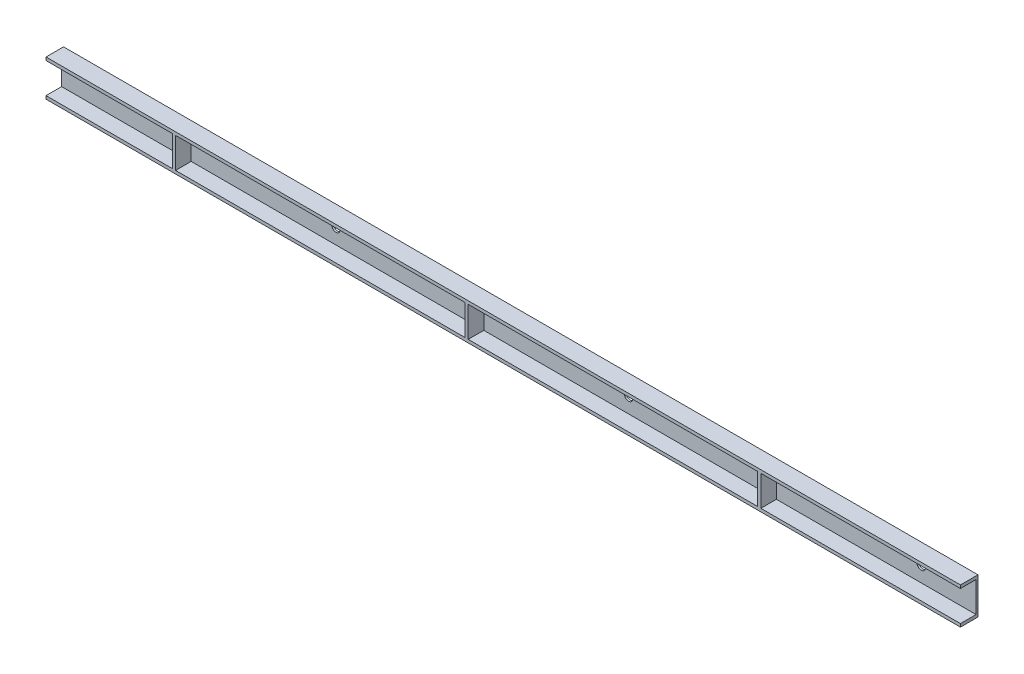
ISO-10303-21;
HEADER;
FILE_DESCRIPTION(('STEP AP214'),'2;1');
FILE_NAME('part.step','',(''),(''),'','','');
FILE_SCHEMA(('AUTOMOTIVE_DESIGN { 1 0 10303 214 1 1 1 1 }'));
ENDSEC;
DATA;
#1=APPLICATION_CONTEXT('core data for automotive mechanical design processes');
#2=APPLICATION_PROTOCOL_DEFINITION('international standard','automotive_design',2000,#1);
#3=PRODUCT_CONTEXT('',#1,'mechanical');
#4=PRODUCT('Part','Part','',(#3));
#5=PRODUCT_RELATED_PRODUCT_CATEGORY('part','',(#4));
#6=PRODUCT_DEFINITION_FORMATION('','',#4);
#7=PRODUCT_DEFINITION_CONTEXT('part definition',#1,'design');
#8=PRODUCT_DEFINITION('design','',#6,#7);
#9=PRODUCT_DEFINITION_SHAPE('','',#8);
#10=(LENGTH_UNIT() NAMED_UNIT(*) SI_UNIT(.MILLI.,.METRE.));
#11=(NAMED_UNIT(*) PLANE_ANGLE_UNIT() SI_UNIT($,.RADIAN.));
#12=(NAMED_UNIT(*) SI_UNIT($,.STERADIAN.) SOLID_ANGLE_UNIT());
#13=UNCERTAINTY_MEASURE_WITH_UNIT(LENGTH_MEASURE(1.E-05),#10,'distance_accuracy_value','');
#14=(GEOMETRIC_REPRESENTATION_CONTEXT(3) GLOBAL_UNCERTAINTY_ASSIGNED_CONTEXT((#13)) GLOBAL_UNIT_ASSIGNED_CONTEXT((#10,
#11,#12)) REPRESENTATION_CONTEXT('',''));
#15=CARTESIAN_POINT('',(0.,0.,0.));
#16=DIRECTION('',(0.,0.,1.));
#17=DIRECTION('',(1.,0.,0.));
#18=AXIS2_PLACEMENT_3D('',#15,#16,#17);
#19=CARTESIAN_POINT('',(0.,91.5,5.3));
#20=DIRECTION('',(0.,1.,0.));
#21=DIRECTION('',(0.,0.,1.));
#22=AXIS2_PLACEMENT_3D('',#19,#20,#21);
#23=PLANE('',#22);
#24=DIRECTION('',(0.,0.,-1.));
#25=VECTOR('',#24,1.);
#26=CARTESIAN_POINT('',(3745.75,91.5,48.));
#27=LINE('',#26,#25);
#28=CARTESIAN_POINT('',(3745.75,91.5,48.));
#29=VERTEX_POINT('',#28);
#30=CARTESIAN_POINT('',(3745.75,91.5,5.3));
#31=VERTEX_POINT('',#30);
#32=EDGE_CURVE('E284',#29,#31,#27,.T.);
#33=ORIENTED_EDGE('',*,*,#32,.F.);
#34=DIRECTION('',(-1.,0.,0.));
#35=VECTOR('',#34,1.);
#36=CARTESIAN_POINT('',(0.,91.5,48.));
#37=LINE('',#36,#35);
#38=CARTESIAN_POINT('',(2954.25,91.5,48.));
#39=VERTEX_POINT('',#38);
#40=EDGE_CURVE('E216',#29,#39,#37,.T.);
#41=ORIENTED_EDGE('',*,*,#40,.T.);
#42=DIRECTION('',(0.,0.,-1.));
#43=VECTOR('',#42,1.);
#44=CARTESIAN_POINT('',(2954.25,91.5,48.));
#45=LINE('',#44,#43);
#46=CARTESIAN_POINT('',(2954.25,91.5,5.3));
#47=VERTEX_POINT('',#46);
#48=EDGE_CURVE('E259',#39,#47,#45,.T.);
#49=ORIENTED_EDGE('',*,*,#48,.T.);
#50=DIRECTION('',(-1.,0.,0.));
#51=VECTOR('',#50,1.);
#52=CARTESIAN_POINT('',(0.,91.5,5.3));
#53=LINE('',#52,#51);
#54=EDGE_CURVE('E223',#31,#47,#53,.T.);
#55=ORIENTED_EDGE('',*,*,#54,.F.);
#56=EDGE_LOOP('',(#33,#41,#49,#55));
#57=FACE_BOUND('',#56,.T.);
#58=ADVANCED_FACE('F32',(#57),#23,.F.);
#59=DIRECTION('',(0.,0.,-1.));
#60=VECTOR('',#59,1.);
#61=CARTESIAN_POINT('',(3754.25,91.5,48.));
#62=LINE('',#61,#60);
#63=CARTESIAN_POINT('',(3754.25,91.5,48.));
#64=VERTEX_POINT('',#63);
#65=CARTESIAN_POINT('',(3754.25,91.5,5.3));
#66=VERTEX_POINT('',#65);
#67=EDGE_CURVE('E282',#64,#66,#62,.T.);
#68=ORIENTED_EDGE('',*,*,#67,.T.);
#69=CARTESIAN_POINT('',(4300.,91.5,5.3));
#70=VERTEX_POINT('',#69);
#71=EDGE_CURVE('E211',#70,#66,#53,.T.);
#72=ORIENTED_EDGE('',*,*,#71,.F.);
#73=DIRECTION('',(0.,0.,1.));
#74=VECTOR('',#73,1.);
#75=CARTESIAN_POINT('',(4300.,91.5,5.3));
#76=LINE('',#75,#74);
#77=CARTESIAN_POINT('',(4300.,91.5,48.));
#78=VERTEX_POINT('',#77);
#79=EDGE_CURVE('E201',#70,#78,#76,.T.);
#80=ORIENTED_EDGE('',*,*,#79,.T.);
#81=EDGE_CURVE('E213',#78,#64,#37,.T.);
#82=ORIENTED_EDGE('',*,*,#81,.T.);
#83=EDGE_LOOP('',(#68,#72,#80,#82));
#84=FACE_BOUND('',#83,.T.);
#85=ADVANCED_FACE('F342',(#84),#23,.F.);
#86=CARTESIAN_POINT('',(0.,8.50000000000001,5.3));
#87=DIRECTION('',(0.,-1.,0.));
#88=DIRECTION('',(1.,0.,0.));
#89=AXIS2_PLACEMENT_3D('',#86,#87,#88);
#90=PLANE('',#89);
#91=DIRECTION('',(0.,0.,-1.));
#92=VECTOR('',#91,1.);
#93=CARTESIAN_POINT('',(3745.75,8.50000000000001,48.));
#94=LINE('',#93,#92);
#95=CARTESIAN_POINT('',(3745.75,8.5,48.));
#96=VERTEX_POINT('',#95);
#97=CARTESIAN_POINT('',(3745.75,8.5,5.3));
#98=VERTEX_POINT('',#97);
#99=EDGE_CURVE('E273',#96,#98,#94,.T.);
#100=ORIENTED_EDGE('',*,*,#99,.T.);
#101=DIRECTION('',(1.,0.,0.));
#102=VECTOR('',#101,1.);
#103=CARTESIAN_POINT('',(0.,8.50000000000001,5.3));
#104=LINE('',#103,#102);
#105=CARTESIAN_POINT('',(2954.25,8.5,5.3));
#106=VERTEX_POINT('',#105);
#107=EDGE_CURVE('E437',#106,#98,#104,.T.);
#108=ORIENTED_EDGE('',*,*,#107,.F.);
#109=DIRECTION('',(0.,0.,-1.));
#110=VECTOR('',#109,1.);
#111=CARTESIAN_POINT('',(2954.25,8.50000000000001,48.));
#112=LINE('',#111,#110);
#113=CARTESIAN_POINT('',(2954.25,8.5,48.));
#114=VERTEX_POINT('',#113);
#115=EDGE_CURVE('E256',#114,#106,#112,.T.);
#116=ORIENTED_EDGE('',*,*,#115,.F.);
#117=DIRECTION('',(1.,0.,0.));
#118=VECTOR('',#117,1.);
#119=CARTESIAN_POINT('',(0.,8.50000000000001,48.));
#120=LINE('',#119,#118);
#121=EDGE_CURVE('E337',#114,#96,#120,.T.);
#122=ORIENTED_EDGE('',*,*,#121,.T.);
#123=EDGE_LOOP('',(#100,#108,#116,#122));
#124=FACE_BOUND('',#123,.T.);
#125=ADVANCED_FACE('F378',(#124),#90,.F.);
#126=DIRECTION('',(0.,0.,-1.));
#127=VECTOR('',#126,1.);
#128=CARTESIAN_POINT('',(3754.25,8.50000000000001,48.));
#129=LINE('',#128,#127);
#130=CARTESIAN_POINT('',(3754.25,8.5,48.));
#131=VERTEX_POINT('',#130);
#132=CARTESIAN_POINT('',(3754.25,8.5,5.3));
#133=VERTEX_POINT('',#132);
#134=EDGE_CURVE('E279',#131,#133,#129,.T.);
#135=ORIENTED_EDGE('',*,*,#134,.F.);
#136=CARTESIAN_POINT('',(4300.,8.5,48.));
#137=VERTEX_POINT('',#136);
#138=EDGE_CURVE('E221',#131,#137,#120,.T.);
#139=ORIENTED_EDGE('',*,*,#138,.T.);
#140=DIRECTION('',(0.,0.,1.));
#141=VECTOR('',#140,1.);
#142=CARTESIAN_POINT('',(4300.,8.5,5.3));
#143=LINE('',#142,#141);
#144=CARTESIAN_POINT('',(4300.,8.5,5.3));
#145=VERTEX_POINT('',#144);
#146=EDGE_CURVE('E208',#145,#137,#143,.T.);
#147=ORIENTED_EDGE('',*,*,#146,.F.);
#148=EDGE_CURVE('E215',#133,#145,#104,.T.);
#149=ORIENTED_EDGE('',*,*,#148,.F.);
#150=EDGE_LOOP('',(#135,#139,#147,#149));
#151=FACE_BOUND('',#150,.T.);
#152=ADVANCED_FACE('F402',(#151),#90,.F.);
#153=CARTESIAN_POINT('',(0.,8.50000000000001,5.3));
#154=DIRECTION('',(0.,0.,1.));
#155=DIRECTION('',(1.,0.,0.));
#156=AXIS2_PLACEMENT_3D('',#153,#154,#155);
#157=PLANE('',#156);
#158=CARTESIAN_POINT('',(3350.,50.,5.3));
#159=DIRECTION('',(0.,0.,1.));
#160=DIRECTION('',(1.,0.,0.));
#161=AXIS2_PLACEMENT_3D('',#158,#159,#160);
#162=CIRCLE('',#161,11.4999999999997);
#163=CARTESIAN_POINT('',(3361.5,50.,5.3));
#164=VERTEX_POINT('',#163);
#165=EDGE_CURVE('E303',#164,#164,#162,.T.);
#166=ORIENTED_EDGE('',*,*,#165,.F.);
#167=EDGE_LOOP('',(#166));
#168=FACE_BOUND('',#167,.T.);
#169=ORIENTED_EDGE('',*,*,#107,.T.);
#170=DIRECTION('',(0.,-1.,0.));
#171=VECTOR('',#170,1.);
#172=CARTESIAN_POINT('',(3745.75,91.5,5.3));
#173=LINE('',#172,#171);
#174=EDGE_CURVE('E290',#31,#98,#173,.T.);
#175=ORIENTED_EDGE('',*,*,#174,.F.);
#176=ORIENTED_EDGE('',*,*,#54,.T.);
#177=DIRECTION('',(0.,1.,0.));
#178=VECTOR('',#177,1.);
#179=CARTESIAN_POINT('',(2954.25,91.5,5.3));
#180=LINE('',#179,#178);
#181=EDGE_CURVE('E266',#106,#47,#180,.T.);
#182=ORIENTED_EDGE('',*,*,#181,.F.);
#183=EDGE_LOOP('',(#169,#175,#176,#182));
#184=FACE_BOUND('',#183,.T.);
#185=ADVANCED_FACE('F403',(#168,#184),#157,.T.);
#186=CARTESIAN_POINT('',(4150.,50.,5.3));
#187=DIRECTION('',(0.,0.,1.));
#188=DIRECTION('',(1.,0.,0.));
#189=AXIS2_PLACEMENT_3D('',#186,#187,#188);
#190=CIRCLE('',#189,11.4999999999997);
#191=CARTESIAN_POINT('',(4161.5,50.,5.3));
#192=VERTEX_POINT('',#191);
#193=EDGE_CURVE('E293',#192,#192,#190,.T.);
#194=ORIENTED_EDGE('',*,*,#193,.F.);
#195=EDGE_LOOP('',(#194));
#196=FACE_BOUND('',#195,.T.);
#197=ORIENTED_EDGE('',*,*,#71,.T.);
#198=DIRECTION('',(0.,1.,0.));
#199=VECTOR('',#198,1.);
#200=CARTESIAN_POINT('',(3754.25,91.5,5.3));
#201=LINE('',#200,#199);
#202=EDGE_CURVE('E55',#133,#66,#201,.T.);
#203=ORIENTED_EDGE('',*,*,#202,.F.);
#204=ORIENTED_EDGE('',*,*,#148,.T.);
#205=DIRECTION('',(0.,1.,0.));
#206=VECTOR('',#205,1.);
#207=CARTESIAN_POINT('',(4300.,91.5,5.3));
#208=LINE('',#207,#206);
#209=EDGE_CURVE('E225',#145,#70,#208,.T.);
#210=ORIENTED_EDGE('',*,*,#209,.T.);
#211=EDGE_LOOP('',(#197,#203,#204,#210));
#212=FACE_BOUND('',#211,.T.);
#213=ADVANCED_FACE('F344',(#196,#212),#157,.T.);
#214=DIRECTION('',(0.,0.,-1.));
#215=VECTOR('',#214,1.);
#216=CARTESIAN_POINT('',(2945.75,91.5,48.));
#217=LINE('',#216,#215);
#218=CARTESIAN_POINT('',(2945.75,91.5,48.));
#219=VERTEX_POINT('',#218);
#220=CARTESIAN_POINT('',(2945.75,91.5,5.3));
#221=VERTEX_POINT('',#220);
#222=EDGE_CURVE('E262',#219,#221,#217,.T.);
#223=ORIENTED_EDGE('',*,*,#222,.F.);
#224=CARTESIAN_POINT('',(2154.25,91.5,48.));
#225=VERTEX_POINT('',#224);
#226=EDGE_CURVE('E408',#219,#225,#37,.T.);
#227=ORIENTED_EDGE('',*,*,#226,.T.);
#228=DIRECTION('',(0.,0.,-1.));
#229=VECTOR('',#228,1.);
#230=CARTESIAN_POINT('',(2154.25,91.5,48.));
#231=LINE('',#230,#229);
#232=CARTESIAN_POINT('',(2154.25,91.5,5.3));
#233=VERTEX_POINT('',#232);
#234=EDGE_CURVE('E236',#225,#233,#231,.T.);
#235=ORIENTED_EDGE('',*,*,#234,.T.);
#236=EDGE_CURVE('E409',#221,#233,#53,.T.);
#237=ORIENTED_EDGE('',*,*,#236,.F.);
#238=EDGE_LOOP('',(#223,#227,#235,#237));
#239=FACE_BOUND('',#238,.T.);
#240=ADVANCED_FACE('F379',(#239),#23,.F.);
#241=DIRECTION('',(0.,0.,-1.));
#242=VECTOR('',#241,1.);
#243=CARTESIAN_POINT('',(2945.75,8.50000000000001,48.));
#244=LINE('',#243,#242);
#245=CARTESIAN_POINT('',(2945.75,8.5,48.));
#246=VERTEX_POINT('',#245);
#247=CARTESIAN_POINT('',(2945.75,8.5,5.3));
#248=VERTEX_POINT('',#247);
#249=EDGE_CURVE('E250',#246,#248,#244,.T.);
#250=ORIENTED_EDGE('',*,*,#249,.T.);
#251=CARTESIAN_POINT('',(2154.25,8.5,5.3));
#252=VERTEX_POINT('',#251);
#253=EDGE_CURVE('E229',#252,#248,#104,.T.);
#254=ORIENTED_EDGE('',*,*,#253,.F.);
#255=DIRECTION('',(0.,0.,-1.));
#256=VECTOR('',#255,1.);
#257=CARTESIAN_POINT('',(2154.25,8.50000000000001,48.));
#258=LINE('',#257,#256);
#259=CARTESIAN_POINT('',(2154.25,8.5,48.));
#260=VERTEX_POINT('',#259);
#261=EDGE_CURVE('E233',#260,#252,#258,.T.);
#262=ORIENTED_EDGE('',*,*,#261,.F.);
#263=EDGE_CURVE('E220',#260,#246,#120,.T.);
#264=ORIENTED_EDGE('',*,*,#263,.T.);
#265=EDGE_LOOP('',(#250,#254,#262,#264));
#266=FACE_BOUND('',#265,.T.);
#267=ADVANCED_FACE('F393',(#266),#90,.F.);
#268=CARTESIAN_POINT('',(2550.,50.,5.3));
#269=DIRECTION('',(0.,0.,1.));
#270=DIRECTION('',(1.,0.,0.));
#271=AXIS2_PLACEMENT_3D('',#268,#269,#270);
#272=CIRCLE('',#271,11.4999999999997);
#273=CARTESIAN_POINT('',(2561.5,50.,5.3));
#274=VERTEX_POINT('',#273);
#275=EDGE_CURVE('E309',#274,#274,#272,.T.);
#276=ORIENTED_EDGE('',*,*,#275,.F.);
#277=EDGE_LOOP('',(#276));
#278=FACE_BOUND('',#277,.T.);
#279=ORIENTED_EDGE('',*,*,#253,.T.);
#280=DIRECTION('',(0.,-1.,0.));
#281=VECTOR('',#280,1.);
#282=CARTESIAN_POINT('',(2945.75,91.5,5.3));
#283=LINE('',#282,#281);
#284=EDGE_CURVE('E270',#221,#248,#283,.T.);
#285=ORIENTED_EDGE('',*,*,#284,.F.);
#286=ORIENTED_EDGE('',*,*,#236,.T.);
#287=DIRECTION('',(0.,1.,0.));
#288=VECTOR('',#287,1.);
#289=CARTESIAN_POINT('',(2154.25,91.5,5.3));
#290=LINE('',#289,#288);
#291=EDGE_CURVE('E243',#252,#233,#290,.T.);
#292=ORIENTED_EDGE('',*,*,#291,.F.);
#293=EDGE_LOOP('',(#279,#285,#286,#292));
#294=FACE_BOUND('',#293,.T.);
#295=ADVANCED_FACE('F385',(#278,#294),#157,.T.);
#296=CARTESIAN_POINT('',(2145.75,91.5,48.));
#297=VERTEX_POINT('',#296);
#298=CARTESIAN_POINT('',(1800.,91.5,48.));
#299=VERTEX_POINT('',#298);
#300=EDGE_CURVE('E217',#297,#299,#37,.T.);
#301=ORIENTED_EDGE('',*,*,#300,.T.);
#302=DIRECTION('',(0.,0.,-1.));
#303=VECTOR('',#302,1.);
#304=CARTESIAN_POINT('',(1800.,91.5,5.3));
#305=LINE('',#304,#303);
#306=CARTESIAN_POINT('',(1800.,91.5,5.3));
#307=VERTEX_POINT('',#306);
#308=EDGE_CURVE('E171',#299,#307,#305,.T.);
#309=ORIENTED_EDGE('',*,*,#308,.T.);
#310=CARTESIAN_POINT('',(2145.75,91.5,5.3));
#311=VERTEX_POINT('',#310);
#312=EDGE_CURVE('E224',#311,#307,#53,.T.);
#313=ORIENTED_EDGE('',*,*,#312,.F.);
#314=DIRECTION('',(0.,0.,-1.));
#315=VECTOR('',#314,1.);
#316=CARTESIAN_POINT('',(2145.75,91.5,48.));
#317=LINE('',#316,#315);
#318=EDGE_CURVE('E239',#297,#311,#317,.T.);
#319=ORIENTED_EDGE('',*,*,#318,.F.);
#320=EDGE_LOOP('',(#301,#309,#313,#319));
#321=FACE_BOUND('',#320,.T.);
#322=ADVANCED_FACE('F374',(#321),#23,.F.);
#323=CARTESIAN_POINT('',(1800.,8.5,5.3));
#324=VERTEX_POINT('',#323);
#325=CARTESIAN_POINT('',(2145.75,8.5,5.3));
#326=VERTEX_POINT('',#325);
#327=EDGE_CURVE('E227',#324,#326,#104,.T.);
#328=ORIENTED_EDGE('',*,*,#327,.F.);
#329=DIRECTION('',(0.,0.,1.));
#330=VECTOR('',#329,1.);
#331=CARTESIAN_POINT('',(1800.,8.5,5.3));
#332=LINE('',#331,#330);
#333=CARTESIAN_POINT('',(1800.,8.50000000000004,48.));
#334=VERTEX_POINT('',#333);
#335=EDGE_CURVE('E316',#324,#334,#332,.T.);
#336=ORIENTED_EDGE('',*,*,#335,.T.);
#337=CARTESIAN_POINT('',(2145.75,8.5,48.));
#338=VERTEX_POINT('',#337);
#339=EDGE_CURVE('E218',#334,#338,#120,.T.);
#340=ORIENTED_EDGE('',*,*,#339,.T.);
#341=DIRECTION('',(0.,0.,-1.));
#342=VECTOR('',#341,1.);
#343=CARTESIAN_POINT('',(2145.75,8.50000000000001,48.));
#344=LINE('',#343,#342);
#345=EDGE_CURVE('E230',#338,#326,#344,.T.);
#346=ORIENTED_EDGE('',*,*,#345,.T.);
#347=EDGE_LOOP('',(#328,#336,#340,#346));
#348=FACE_BOUND('',#347,.T.);
#349=ADVANCED_FACE('F384',(#348),#90,.F.);
#350=DIRECTION('',(0.,1.,0.));
#351=VECTOR('',#350,1.);
#352=CARTESIAN_POINT('',(1800.,8.50000000000001,5.3));
#353=LINE('',#352,#351);
#354=EDGE_CURVE('E319',#324,#307,#353,.T.);
#355=ORIENTED_EDGE('',*,*,#354,.F.);
#356=ORIENTED_EDGE('',*,*,#327,.T.);
#357=DIRECTION('',(0.,-1.,0.));
#358=VECTOR('',#357,1.);
#359=CARTESIAN_POINT('',(2145.75,91.5,5.3));
#360=LINE('',#359,#358);
#361=EDGE_CURVE('E247',#311,#326,#360,.T.);
#362=ORIENTED_EDGE('',*,*,#361,.F.);
#363=ORIENTED_EDGE('',*,*,#312,.T.);
#364=EDGE_LOOP('',(#355,#356,#362,#363));
#365=FACE_BOUND('',#364,.T.);
#366=ADVANCED_FACE('F391',(#365),#157,.T.);
#367=CARTESIAN_POINT('',(0.,0.,48.));
#368=DIRECTION('',(0.,1.,0.));
#369=DIRECTION('',(0.,0.,1.));
#370=AXIS2_PLACEMENT_3D('',#367,#368,#369);
#371=PLANE('',#370);
#372=DIRECTION('',(1.,0.,0.));
#373=VECTOR('',#372,1.);
#374=CARTESIAN_POINT('',(0.,0.,48.));
#375=LINE('',#374,#373);
#376=CARTESIAN_POINT('',(1800.,0.,48.));
#377=VERTEX_POINT('',#376);
#378=CARTESIAN_POINT('',(4300.,0.,48.));
#379=VERTEX_POINT('',#378);
#380=EDGE_CURVE('E203',#377,#379,#375,.T.);
#381=ORIENTED_EDGE('',*,*,#380,.F.);
#382=DIRECTION('',(0.,0.,-1.));
#383=VECTOR('',#382,1.);
#384=CARTESIAN_POINT('',(1800.,0.,48.));
#385=LINE('',#384,#383);
#386=CARTESIAN_POINT('',(1800.,0.,0.));
#387=VERTEX_POINT('',#386);
#388=EDGE_CURVE('E185',#377,#387,#385,.T.);
#389=ORIENTED_EDGE('',*,*,#388,.T.);
#390=DIRECTION('',(1.,0.,0.));
#391=VECTOR('',#390,1.);
#392=CARTESIAN_POINT('',(0.,0.,0.));
#393=LINE('',#392,#391);
#394=CARTESIAN_POINT('',(4300.,0.,0.));
#395=VERTEX_POINT('',#394);
#396=EDGE_CURVE('E198',#387,#395,#393,.T.);
#397=ORIENTED_EDGE('',*,*,#396,.T.);
#398=DIRECTION('',(0.,0.,-1.));
#399=VECTOR('',#398,1.);
#400=CARTESIAN_POINT('',(4300.,0.,48.));
#401=LINE('',#400,#399);
#402=EDGE_CURVE('E11',#379,#395,#401,.T.);
#403=ORIENTED_EDGE('',*,*,#402,.F.);
#404=EDGE_LOOP('',(#381,#389,#397,#403));
#405=FACE_BOUND('',#404,.T.);
#406=ADVANCED_FACE('F34',(#405),#371,.F.);
#407=CARTESIAN_POINT('',(4300.,0.,48.));
#408=DIRECTION('',(-1.,0.,0.));
#409=DIRECTION('',(0.,-1.,0.));
#410=AXIS2_PLACEMENT_3D('',#407,#408,#409);
#411=PLANE('',#410);
#412=DIRECTION('',(0.,1.,0.));
#413=VECTOR('',#412,1.);
#414=CARTESIAN_POINT('',(4300.,0.,48.));
#415=LINE('',#414,#413);
#416=CARTESIAN_POINT('',(4300.,100.,48.));
#417=VERTEX_POINT('',#416);
#418=EDGE_CURVE('E190',#78,#417,#415,.T.);
#419=ORIENTED_EDGE('',*,*,#418,.F.);
#420=ORIENTED_EDGE('',*,*,#79,.F.);
#421=ORIENTED_EDGE('',*,*,#209,.F.);
#422=ORIENTED_EDGE('',*,*,#146,.T.);
#423=EDGE_CURVE('E192',#379,#137,#415,.T.);
#424=ORIENTED_EDGE('',*,*,#423,.F.);
#425=ORIENTED_EDGE('',*,*,#402,.T.);
#426=DIRECTION('',(0.,1.,0.));
#427=VECTOR('',#426,1.);
#428=CARTESIAN_POINT('',(4300.,0.,0.));
#429=LINE('',#428,#427);
#430=CARTESIAN_POINT('',(4300.,100.,0.));
#431=VERTEX_POINT('',#430);
#432=EDGE_CURVE('E200',#395,#431,#429,.T.);
#433=ORIENTED_EDGE('',*,*,#432,.T.);
#434=DIRECTION('',(0.,0.,-1.));
#435=VECTOR('',#434,1.);
#436=CARTESIAN_POINT('',(4300.,100.,48.));
#437=LINE('',#436,#435);
#438=EDGE_CURVE('E40',#417,#431,#437,.T.);
#439=ORIENTED_EDGE('',*,*,#438,.F.);
#440=EDGE_LOOP('',(#419,#420,#421,#422,#424,#425,#433,#439));
#441=FACE_BOUND('',#440,.T.);
#442=ADVANCED_FACE('F330',(#441),#411,.F.);
#443=CARTESIAN_POINT('',(0.,100.,48.));
#444=DIRECTION('',(0.,-1.,0.));
#445=DIRECTION('',(0.,0.,-1.));
#446=AXIS2_PLACEMENT_3D('',#443,#444,#445);
#447=PLANE('',#446);
#448=DIRECTION('',(-1.,0.,0.));
#449=VECTOR('',#448,1.);
#450=CARTESIAN_POINT('',(0.,100.,0.));
#451=LINE('',#450,#449);
#452=CARTESIAN_POINT('',(1800.,100.,0.));
#453=VERTEX_POINT('',#452);
#454=EDGE_CURVE('E184',#431,#453,#451,.T.);
#455=ORIENTED_EDGE('',*,*,#454,.T.);
#456=DIRECTION('',(0.,0.,-1.));
#457=VECTOR('',#456,1.);
#458=CARTESIAN_POINT('',(1800.,99.9999999999998,48.));
#459=LINE('',#458,#457);
#460=CARTESIAN_POINT('',(1800.,99.9999999999998,48.));
#461=VERTEX_POINT('',#460);
#462=EDGE_CURVE('E47',#461,#453,#459,.T.);
#463=ORIENTED_EDGE('',*,*,#462,.F.);
#464=DIRECTION('',(-1.,0.,0.));
#465=VECTOR('',#464,1.);
#466=CARTESIAN_POINT('',(0.,100.,48.));
#467=LINE('',#466,#465);
#468=EDGE_CURVE('E182',#417,#461,#467,.T.);
#469=ORIENTED_EDGE('',*,*,#468,.F.);
#470=ORIENTED_EDGE('',*,*,#438,.T.);
#471=EDGE_LOOP('',(#455,#463,#469,#470));
#472=FACE_BOUND('',#471,.T.);
#473=ADVANCED_FACE('F180',(#472),#447,.F.);
#474=CARTESIAN_POINT('',(0.,100.,48.));
#475=DIRECTION('',(0.,0.,-1.));
#476=DIRECTION('',(-1.,0.,0.));
#477=AXIS2_PLACEMENT_3D('',#474,#475,#476);
#478=PLANE('',#477);
#479=ORIENTED_EDGE('',*,*,#121,.F.);
#480=DIRECTION('',(0.,1.,0.));
#481=VECTOR('',#480,1.);
#482=CARTESIAN_POINT('',(2954.25,91.5,48.));
#483=LINE('',#482,#481);
#484=EDGE_CURVE('E265',#114,#39,#483,.T.);
#485=ORIENTED_EDGE('',*,*,#484,.T.);
#486=ORIENTED_EDGE('',*,*,#40,.F.);
#487=DIRECTION('',(0.,-1.,0.));
#488=VECTOR('',#487,1.);
#489=CARTESIAN_POINT('',(3745.75,91.5,48.));
#490=LINE('',#489,#488);
#491=EDGE_CURVE('E289',#29,#96,#490,.T.);
#492=ORIENTED_EDGE('',*,*,#491,.T.);
#493=EDGE_LOOP('',(#479,#485,#486,#492));
#494=FACE_BOUND('',#493,.T.);
#495=ORIENTED_EDGE('',*,*,#263,.F.);
#496=DIRECTION('',(0.,1.,0.));
#497=VECTOR('',#496,1.);
#498=CARTESIAN_POINT('',(2154.25,91.5,48.));
#499=LINE('',#498,#497);
#500=EDGE_CURVE('E242',#260,#225,#499,.T.);
#501=ORIENTED_EDGE('',*,*,#500,.T.);
#502=ORIENTED_EDGE('',*,*,#226,.F.);
#503=DIRECTION('',(0.,-1.,0.));
#504=VECTOR('',#503,1.);
#505=CARTESIAN_POINT('',(2945.75,91.5,48.));
#506=LINE('',#505,#504);
#507=EDGE_CURVE('E269',#219,#246,#506,.T.);
#508=ORIENTED_EDGE('',*,*,#507,.T.);
#509=EDGE_LOOP('',(#495,#501,#502,#508));
#510=FACE_BOUND('',#509,.T.);
#511=ORIENTED_EDGE('',*,*,#468,.T.);
#512=DIRECTION('',(0.,-1.,0.));
#513=VECTOR('',#512,1.);
#514=CARTESIAN_POINT('',(1800.,99.9999999999998,48.));
#515=LINE('',#514,#513);
#516=EDGE_CURVE('E168',#461,#299,#515,.T.);
#517=ORIENTED_EDGE('',*,*,#516,.T.);
#518=ORIENTED_EDGE('',*,*,#300,.F.);
#519=DIRECTION('',(0.,-1.,0.));
#520=VECTOR('',#519,1.);
#521=CARTESIAN_POINT('',(2145.75,91.5,48.));
#522=LINE('',#521,#520);
#523=EDGE_CURVE('E246',#297,#338,#522,.T.);
#524=ORIENTED_EDGE('',*,*,#523,.T.);
#525=ORIENTED_EDGE('',*,*,#339,.F.);
#526=EDGE_CURVE('E175',#334,#377,#515,.T.);
#527=ORIENTED_EDGE('',*,*,#526,.T.);
#528=ORIENTED_EDGE('',*,*,#380,.T.);
#529=ORIENTED_EDGE('',*,*,#423,.T.);
#530=ORIENTED_EDGE('',*,*,#138,.F.);
#531=DIRECTION('',(0.,1.,0.));
#532=VECTOR('',#531,1.);
#533=CARTESIAN_POINT('',(3754.25,91.5,48.));
#534=LINE('',#533,#532);
#535=EDGE_CURVE('E287',#131,#64,#534,.T.);
#536=ORIENTED_EDGE('',*,*,#535,.T.);
#537=ORIENTED_EDGE('',*,*,#81,.F.);
#538=ORIENTED_EDGE('',*,*,#418,.T.);
#539=EDGE_LOOP('',(#511,#517,#518,#524,#525,#527,#528,#529,#530,#536,#537,#538));
#540=FACE_BOUND('',#539,.T.);
#541=ADVANCED_FACE('F187',(#494,#510,#540),#478,.F.);
#542=CARTESIAN_POINT('',(0.,100.,0.));
#543=DIRECTION('',(0.,0.,-1.));
#544=DIRECTION('',(-1.,0.,0.));
#545=AXIS2_PLACEMENT_3D('',#542,#543,#544);
#546=PLANE('',#545);
#547=DIRECTION('',(0.,-1.,0.));
#548=VECTOR('',#547,1.);
#549=CARTESIAN_POINT('',(1800.,99.9999999999998,0.));
#550=LINE('',#549,#548);
#551=EDGE_CURVE('E323',#453,#387,#550,.T.);
#552=ORIENTED_EDGE('',*,*,#551,.F.);
#553=ORIENTED_EDGE('',*,*,#454,.F.);
#554=ORIENTED_EDGE('',*,*,#432,.F.);
#555=ORIENTED_EDGE('',*,*,#396,.F.);
#556=EDGE_LOOP('',(#552,#553,#554,#555));
#557=FACE_BOUND('',#556,.T.);
#558=CARTESIAN_POINT('',(2550.,50.,0.));
#559=DIRECTION('',(0.,0.,-1.));
#560=DIRECTION('',(-1.,0.,0.));
#561=AXIS2_PLACEMENT_3D('',#558,#559,#560);
#562=CIRCLE('',#561,11.4999999999997);
#563=CARTESIAN_POINT('',(2538.5,50.,0.));
#564=VERTEX_POINT('',#563);
#565=EDGE_CURVE('E312',#564,#564,#562,.T.);
#566=ORIENTED_EDGE('',*,*,#565,.F.);
#567=EDGE_LOOP('',(#566));
#568=FACE_BOUND('',#567,.T.);
#569=CARTESIAN_POINT('',(3350.,50.,0.));
#570=DIRECTION('',(0.,0.,-1.));
#571=DIRECTION('',(-1.,0.,0.));
#572=AXIS2_PLACEMENT_3D('',#569,#570,#571);
#573=CIRCLE('',#572,11.4999999999997);
#574=CARTESIAN_POINT('',(3338.5,50.,0.));
#575=VERTEX_POINT('',#574);
#576=EDGE_CURVE('E306',#575,#575,#573,.T.);
#577=ORIENTED_EDGE('',*,*,#576,.F.);
#578=EDGE_LOOP('',(#577));
#579=FACE_BOUND('',#578,.T.);
#580=CARTESIAN_POINT('',(4150.,50.,0.));
#581=DIRECTION('',(0.,0.,-1.));
#582=DIRECTION('',(-1.,0.,0.));
#583=AXIS2_PLACEMENT_3D('',#580,#581,#582);
#584=CIRCLE('',#583,11.4999999999997);
#585=CARTESIAN_POINT('',(4138.5,50.,0.));
#586=VERTEX_POINT('',#585);
#587=EDGE_CURVE('E300',#586,#586,#584,.T.);
#588=ORIENTED_EDGE('',*,*,#587,.F.);
#589=EDGE_LOOP('',(#588));
#590=FACE_BOUND('',#589,.T.);
#591=ADVANCED_FACE('F346',(#557,#568,#579,#590),#546,.T.);
#592=CARTESIAN_POINT('',(2145.75,91.5,48.));
#593=DIRECTION('',(1.,0.,0.));
#594=DIRECTION('',(0.,0.,-1.));
#595=AXIS2_PLACEMENT_3D('',#592,#593,#594);
#596=PLANE('',#595);
#597=ORIENTED_EDGE('',*,*,#361,.T.);
#598=ORIENTED_EDGE('',*,*,#345,.F.);
#599=ORIENTED_EDGE('',*,*,#523,.F.);
#600=ORIENTED_EDGE('',*,*,#318,.T.);
#601=EDGE_LOOP('',(#597,#598,#599,#600));
#602=FACE_BOUND('',#601,.T.);
#603=ADVANCED_FACE('F349',(#602),#596,.F.);
#604=CARTESIAN_POINT('',(2154.25,91.5,48.));
#605=DIRECTION('',(-1.,0.,0.));
#606=DIRECTION('',(0.,0.,1.));
#607=AXIS2_PLACEMENT_3D('',#604,#605,#606);
#608=PLANE('',#607);
#609=ORIENTED_EDGE('',*,*,#291,.T.);
#610=ORIENTED_EDGE('',*,*,#234,.F.);
#611=ORIENTED_EDGE('',*,*,#500,.F.);
#612=ORIENTED_EDGE('',*,*,#261,.T.);
#613=EDGE_LOOP('',(#609,#610,#611,#612));
#614=FACE_BOUND('',#613,.T.);
#615=ADVANCED_FACE('F444',(#614),#608,.F.);
#616=CARTESIAN_POINT('',(2945.75,91.5,48.));
#617=DIRECTION('',(1.,0.,0.));
#618=DIRECTION('',(0.,0.,-1.));
#619=AXIS2_PLACEMENT_3D('',#616,#617,#618);
#620=PLANE('',#619);
#621=ORIENTED_EDGE('',*,*,#284,.T.);
#622=ORIENTED_EDGE('',*,*,#249,.F.);
#623=ORIENTED_EDGE('',*,*,#507,.F.);
#624=ORIENTED_EDGE('',*,*,#222,.T.);
#625=EDGE_LOOP('',(#621,#622,#623,#624));
#626=FACE_BOUND('',#625,.T.);
#627=ADVANCED_FACE('F412',(#626),#620,.F.);
#628=CARTESIAN_POINT('',(2954.25,91.5,48.));
#629=DIRECTION('',(-1.,0.,0.));
#630=DIRECTION('',(0.,0.,1.));
#631=AXIS2_PLACEMENT_3D('',#628,#629,#630);
#632=PLANE('',#631);
#633=ORIENTED_EDGE('',*,*,#181,.T.);
#634=ORIENTED_EDGE('',*,*,#48,.F.);
#635=ORIENTED_EDGE('',*,*,#484,.F.);
#636=ORIENTED_EDGE('',*,*,#115,.T.);
#637=EDGE_LOOP('',(#633,#634,#635,#636));
#638=FACE_BOUND('',#637,.T.);
#639=ADVANCED_FACE('F434',(#638),#632,.F.);
#640=CARTESIAN_POINT('',(3745.75,91.5,48.));
#641=DIRECTION('',(1.,0.,0.));
#642=DIRECTION('',(0.,0.,-1.));
#643=AXIS2_PLACEMENT_3D('',#640,#641,#642);
#644=PLANE('',#643);
#645=ORIENTED_EDGE('',*,*,#174,.T.);
#646=ORIENTED_EDGE('',*,*,#99,.F.);
#647=ORIENTED_EDGE('',*,*,#491,.F.);
#648=ORIENTED_EDGE('',*,*,#32,.T.);
#649=EDGE_LOOP('',(#645,#646,#647,#648));
#650=FACE_BOUND('',#649,.T.);
#651=ADVANCED_FACE('F369',(#650),#644,.F.);
#652=CARTESIAN_POINT('',(3754.25,91.5,48.));
#653=DIRECTION('',(-1.,0.,0.));
#654=DIRECTION('',(0.,0.,1.));
#655=AXIS2_PLACEMENT_3D('',#652,#653,#654);
#656=PLANE('',#655);
#657=ORIENTED_EDGE('',*,*,#202,.T.);
#658=ORIENTED_EDGE('',*,*,#67,.F.);
#659=ORIENTED_EDGE('',*,*,#535,.F.);
#660=ORIENTED_EDGE('',*,*,#134,.T.);
#661=EDGE_LOOP('',(#657,#658,#659,#660));
#662=FACE_BOUND('',#661,.T.);
#663=ADVANCED_FACE('F339',(#662),#656,.F.);
#664=CARTESIAN_POINT('',(4150.,50.,48.));
#665=DIRECTION('',(0.,0.,-1.));
#666=DIRECTION('',(-1.,0.,0.));
#667=AXIS2_PLACEMENT_3D('',#664,#665,#666);
#668=CYLINDRICAL_SURFACE('',#667,11.4999999999997);
#669=ORIENTED_EDGE('',*,*,#193,.T.);
#670=EDGE_LOOP('',(#669));
#671=FACE_BOUND('',#670,.T.);
#672=ORIENTED_EDGE('',*,*,#587,.T.);
#673=EDGE_LOOP('',(#672));
#674=FACE_BOUND('',#673,.T.);
#675=ADVANCED_FACE('F357',(#671,#674),#668,.F.);
#676=CARTESIAN_POINT('',(3350.,50.,48.));
#677=DIRECTION('',(0.,0.,-1.));
#678=DIRECTION('',(-1.,0.,0.));
#679=AXIS2_PLACEMENT_3D('',#676,#677,#678);
#680=CYLINDRICAL_SURFACE('',#679,11.4999999999997);
#681=ORIENTED_EDGE('',*,*,#165,.T.);
#682=EDGE_LOOP('',(#681));
#683=FACE_BOUND('',#682,.T.);
#684=ORIENTED_EDGE('',*,*,#576,.T.);
#685=EDGE_LOOP('',(#684));
#686=FACE_BOUND('',#685,.T.);
#687=ADVANCED_FACE('F359',(#683,#686),#680,.F.);
#688=CARTESIAN_POINT('',(2550.,50.,48.));
#689=DIRECTION('',(0.,0.,-1.));
#690=DIRECTION('',(-1.,0.,0.));
#691=AXIS2_PLACEMENT_3D('',#688,#689,#690);
#692=CYLINDRICAL_SURFACE('',#691,11.4999999999997);
#693=ORIENTED_EDGE('',*,*,#275,.T.);
#694=EDGE_LOOP('',(#693));
#695=FACE_BOUND('',#694,.T.);
#696=ORIENTED_EDGE('',*,*,#565,.T.);
#697=EDGE_LOOP('',(#696));
#698=FACE_BOUND('',#697,.T.);
#699=ADVANCED_FACE('F366',(#695,#698),#692,.F.);
#700=CARTESIAN_POINT('',(1800.,99.9999999999998,48.));
#701=DIRECTION('',(1.,0.,0.));
#702=DIRECTION('',(0.,0.,-1.));
#703=AXIS2_PLACEMENT_3D('',#700,#701,#702);
#704=PLANE('',#703);
#705=ORIENTED_EDGE('',*,*,#516,.F.);
#706=ORIENTED_EDGE('',*,*,#462,.T.);
#707=ORIENTED_EDGE('',*,*,#551,.T.);
#708=ORIENTED_EDGE('',*,*,#388,.F.);
#709=ORIENTED_EDGE('',*,*,#526,.F.);
#710=ORIENTED_EDGE('',*,*,#335,.F.);
#711=ORIENTED_EDGE('',*,*,#354,.T.);
#712=ORIENTED_EDGE('',*,*,#308,.F.);
#713=EDGE_LOOP('',(#705,#706,#707,#708,#709,#710,#711,#712));
#714=FACE_BOUND('',#713,.T.);
#715=ADVANCED_FACE('F169',(#714),#704,.F.);
#716=CLOSED_SHELL('',(#58,#85,#125,#152,#185,#213,#240,#267,#295,#322,#349,#366,#406,#442,#473,
#541,#591,#603,#615,#627,#639,#651,#663,#675,#687,#699,#715));
#717=MANIFOLD_SOLID_BREP('B2',#716);
#718=ADVANCED_BREP_SHAPE_REPRESENTATION('',(#18,#717),#14);
#719=SHAPE_DEFINITION_REPRESENTATION(#9,#718);
ENDSEC;
END-ISO-10303-21;
